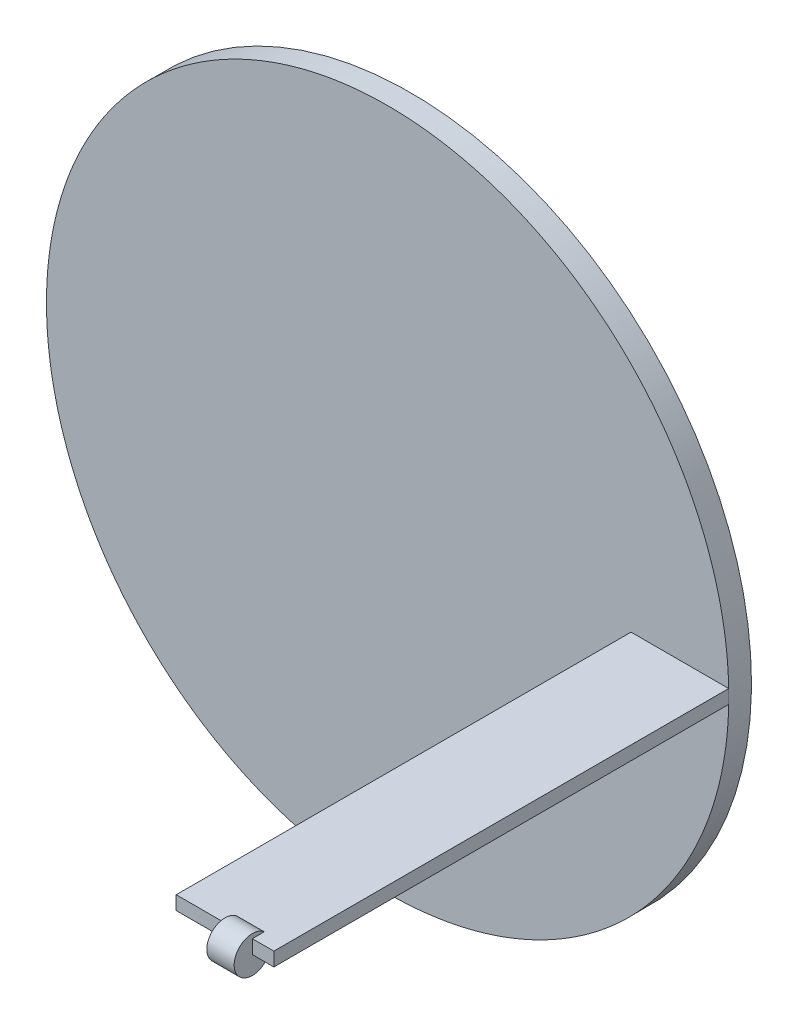
ISO-10303-21;
HEADER;
FILE_DESCRIPTION(('STEP AP214'),'2;1');
FILE_NAME('part.step','',(''),(''),'','','');
FILE_SCHEMA(('AUTOMOTIVE_DESIGN { 1 0 10303 214 1 1 1 1 }'));
ENDSEC;
DATA;
#1=APPLICATION_CONTEXT('core data for automotive mechanical design processes');
#2=APPLICATION_PROTOCOL_DEFINITION('international standard','automotive_design',2000,#1);
#3=PRODUCT_CONTEXT('',#1,'mechanical');
#4=PRODUCT('Part','Part','',(#3));
#5=PRODUCT_RELATED_PRODUCT_CATEGORY('part','',(#4));
#6=PRODUCT_DEFINITION_FORMATION('','',#4);
#7=PRODUCT_DEFINITION_CONTEXT('part definition',#1,'design');
#8=PRODUCT_DEFINITION('design','',#6,#7);
#9=PRODUCT_DEFINITION_SHAPE('','',#8);
#10=(LENGTH_UNIT() NAMED_UNIT(*) SI_UNIT(.MILLI.,.METRE.));
#11=(NAMED_UNIT(*) PLANE_ANGLE_UNIT() SI_UNIT($,.RADIAN.));
#12=(NAMED_UNIT(*) SI_UNIT($,.STERADIAN.) SOLID_ANGLE_UNIT());
#13=UNCERTAINTY_MEASURE_WITH_UNIT(LENGTH_MEASURE(1.E-05),#10,'distance_accuracy_value','');
#14=(GEOMETRIC_REPRESENTATION_CONTEXT(3) GLOBAL_UNCERTAINTY_ASSIGNED_CONTEXT((#13)) GLOBAL_UNIT_ASSIGNED_CONTEXT((#10,
#11,#12)) REPRESENTATION_CONTEXT('',''));
#15=CARTESIAN_POINT('',(0.,0.,0.));
#16=DIRECTION('',(0.,0.,1.));
#17=DIRECTION('',(1.,0.,0.));
#18=AXIS2_PLACEMENT_3D('',#15,#16,#17);
#19=CARTESIAN_POINT('',(70.2503955035648,-1.51817324004955,105.));
#20=DIRECTION('',(-1.,0.,0.));
#21=DIRECTION('',(0.,0.,1.));
#22=AXIS2_PLACEMENT_3D('',#19,#20,#21);
#23=CYLINDRICAL_SURFACE('',#22,3.99999999999997);
#24=CARTESIAN_POINT('',(70.2503955035648,-1.51817324004955,105.));
#25=DIRECTION('',(1.,0.,0.));
#26=DIRECTION('',(0.,0.,-1.));
#27=AXIS2_PLACEMENT_3D('',#24,#25,#26);
#28=CIRCLE('',#27,3.99999999999997);
#29=CARTESIAN_POINT('',(70.2503955035648,-1.51817324004955,101.));
#30=VERTEX_POINT('',#29);
#31=EDGE_CURVE('E11',#30,#30,#28,.T.);
#32=ORIENTED_EDGE('',*,*,#31,.F.);
#33=EDGE_LOOP('',(#32));
#34=FACE_BOUND('',#33,.T.);
#35=CARTESIAN_POINT('',(64.2503955035648,-1.51817324004955,105.));
#36=DIRECTION('',(1.,0.,0.));
#37=DIRECTION('',(0.,0.,-1.));
#38=AXIS2_PLACEMENT_3D('',#35,#36,#37);
#39=CIRCLE('',#38,3.99999999999997);
#40=CARTESIAN_POINT('',(64.2503955035648,-1.51817324004955,101.));
#41=VERTEX_POINT('',#40);
#42=EDGE_CURVE('E55',#41,#41,#39,.T.);
#43=ORIENTED_EDGE('',*,*,#42,.T.);
#44=EDGE_LOOP('',(#43));
#45=FACE_BOUND('',#44,.T.);
#46=ADVANCED_FACE('F52',(#34,#45),#23,.T.);
#47=CARTESIAN_POINT('',(70.2503955035648,-1.51817324004955,105.));
#48=DIRECTION('',(1.,0.,0.));
#49=DIRECTION('',(0.,0.,-1.));
#50=AXIS2_PLACEMENT_3D('',#47,#48,#49);
#51=PLANE('',#50);
#52=ORIENTED_EDGE('',*,*,#31,.T.);
#53=EDGE_LOOP('',(#52));
#54=FACE_BOUND('',#53,.T.);
#55=ADVANCED_FACE('F67',(#54),#51,.T.);
#56=CARTESIAN_POINT('',(64.2503955035648,-1.51817324004955,105.));
#57=DIRECTION('',(1.,0.,0.));
#58=DIRECTION('',(0.,0.,-1.));
#59=AXIS2_PLACEMENT_3D('',#56,#57,#58);
#60=PLANE('',#59);
#61=ORIENTED_EDGE('',*,*,#42,.F.);
#62=EDGE_LOOP('',(#61));
#63=FACE_BOUND('',#62,.T.);
#64=ADVANCED_FACE('F65',(#63),#60,.F.);
#65=CLOSED_SHELL('',(#46,#55,#64));
#66=MANIFOLD_SOLID_BREP('B2',#65);
#67=CARTESIAN_POINT('',(0.,0.,-31.));
#68=DIRECTION('',(0.,0.,1.));
#69=DIRECTION('',(1.,0.,0.));
#70=AXIS2_PLACEMENT_3D('',#67,#68,#69);
#71=CYLINDRICAL_SURFACE('',#70,4.);
#72=CARTESIAN_POINT('',(0.,0.,-31.));
#73=DIRECTION('',(0.,0.,1.));
#74=DIRECTION('',(1.,0.,0.));
#75=AXIS2_PLACEMENT_3D('',#72,#73,#74);
#76=CIRCLE('',#75,4.);
#77=CARTESIAN_POINT('',(4.,0.,-31.));
#78=VERTEX_POINT('',#77);
#79=EDGE_CURVE('E51',#78,#78,#76,.T.);
#80=ORIENTED_EDGE('',*,*,#79,.T.);
#81=EDGE_LOOP('',(#80));
#82=FACE_BOUND('',#81,.T.);
#83=CARTESIAN_POINT('',(0.,0.,-25.));
#84=DIRECTION('',(0.,0.,1.));
#85=DIRECTION('',(1.,0.,0.));
#86=AXIS2_PLACEMENT_3D('',#83,#84,#85);
#87=CIRCLE('',#86,4.);
#88=CARTESIAN_POINT('',(4.,0.,-25.));
#89=VERTEX_POINT('',#88);
#90=EDGE_CURVE('E104',#89,#89,#87,.T.);
#91=ORIENTED_EDGE('',*,*,#90,.F.);
#92=EDGE_LOOP('',(#91));
#93=FACE_BOUND('',#92,.T.);
#94=ADVANCED_FACE('F101',(#82,#93),#71,.T.);
#95=CARTESIAN_POINT('',(0.,0.,-31.));
#96=DIRECTION('',(0.,0.,1.));
#97=DIRECTION('',(1.,0.,0.));
#98=AXIS2_PLACEMENT_3D('',#95,#96,#97);
#99=PLANE('',#98);
#100=ORIENTED_EDGE('',*,*,#79,.F.);
#101=EDGE_LOOP('',(#100));
#102=FACE_BOUND('',#101,.T.);
#103=ADVANCED_FACE('F116',(#102),#99,.F.);
#104=CARTESIAN_POINT('',(0.,0.,-25.));
#105=DIRECTION('',(0.,0.,1.));
#106=DIRECTION('',(1.,0.,0.));
#107=AXIS2_PLACEMENT_3D('',#104,#105,#106);
#108=PLANE('',#107);
#109=ORIENTED_EDGE('',*,*,#90,.T.);
#110=EDGE_LOOP('',(#109));
#111=FACE_BOUND('',#110,.T.);
#112=ADVANCED_FACE('F113',(#111),#108,.T.);
#113=CLOSED_SHELL('',(#94,#103,#112));
#114=MANIFOLD_SOLID_BREP('B6',#113);
#115=CARTESIAN_POINT('',(0.,0.,5.));
#116=DIRECTION('',(0.,0.,-1.));
#117=DIRECTION('',(-1.,0.,0.));
#118=AXIS2_PLACEMENT_3D('',#115,#116,#117);
#119=CYLINDRICAL_SURFACE('',#118,75.);
#120=CARTESIAN_POINT('',(0.,0.,5.));
#121=DIRECTION('',(0.,0.,1.));
#122=DIRECTION('',(1.,0.,0.));
#123=AXIS2_PLACEMENT_3D('',#120,#121,#122);
#124=CIRCLE('',#123,75.);
#125=CARTESIAN_POINT('',(74.984632759074,-1.51817324004955,5.));
#126=VERTEX_POINT('',#125);
#127=EDGE_CURVE('E99',#126,#126,#124,.T.);
#128=ORIENTED_EDGE('',*,*,#127,.F.);
#129=EDGE_LOOP('',(#128));
#130=FACE_BOUND('',#129,.T.);
#131=CARTESIAN_POINT('',(0.,0.,0.));
#132=DIRECTION('',(0.,0.,1.));
#133=DIRECTION('',(1.,0.,0.));
#134=AXIS2_PLACEMENT_3D('',#131,#132,#133);
#135=CIRCLE('',#134,75.);
#136=CARTESIAN_POINT('',(75.,0.,0.));
#137=VERTEX_POINT('',#136);
#138=EDGE_CURVE('E150',#137,#137,#135,.T.);
#139=ORIENTED_EDGE('',*,*,#138,.T.);
#140=EDGE_LOOP('',(#139));
#141=FACE_BOUND('',#140,.T.);
#142=ADVANCED_FACE('F141',(#130,#141),#119,.T.);
#143=CARTESIAN_POINT('',(0.,0.,5.));
#144=DIRECTION('',(0.,0.,1.));
#145=DIRECTION('',(1.,0.,0.));
#146=AXIS2_PLACEMENT_3D('',#143,#144,#145);
#147=PLANE('',#146);
#148=DIRECTION('',(0.,1.,0.));
#149=VECTOR('',#148,1.);
#150=CARTESIAN_POINT('',(74.9846327590741,-1.51817324004955,5.));
#151=LINE('',#150,#149);
#152=CARTESIAN_POINT('',(74.9846327590741,1.50504399009494,5.));
#153=VERTEX_POINT('',#152);
#154=EDGE_CURVE('E206',#126,#153,#151,.T.);
#155=ORIENTED_EDGE('',*,*,#154,.F.);
#156=ORIENTED_EDGE('',*,*,#127,.T.);
#157=DIRECTION('',(1.,0.,0.));
#158=VECTOR('',#157,1.);
#159=CARTESIAN_POINT('',(74.9846327590741,-1.51817324004955,5.));
#160=LINE('',#159,#158);
#161=CARTESIAN_POINT('',(53.5161582480555,-1.51817324004956,5.));
#162=VERTEX_POINT('',#161);
#163=EDGE_CURVE('E157',#162,#126,#160,.T.);
#164=ORIENTED_EDGE('',*,*,#163,.F.);
#165=DIRECTION('',(0.,-1.,0.));
#166=VECTOR('',#165,1.);
#167=CARTESIAN_POINT('',(53.5161582480555,-1.51817324004956,5.));
#168=LINE('',#167,#166);
#169=CARTESIAN_POINT('',(53.5161582480555,1.50504399009494,5.));
#170=VERTEX_POINT('',#169);
#171=EDGE_CURVE('E253',#170,#162,#168,.T.);
#172=ORIENTED_EDGE('',*,*,#171,.F.);
#173=DIRECTION('',(-1.,0.,0.));
#174=VECTOR('',#173,1.);
#175=CARTESIAN_POINT('',(74.9846327590741,1.50504399009494,5.));
#176=LINE('',#175,#174);
#177=EDGE_CURVE('E163',#153,#170,#176,.T.);
#178=ORIENTED_EDGE('',*,*,#177,.F.);
#179=EDGE_LOOP('',(#155,#156,#164,#172,#178));
#180=FACE_BOUND('',#179,.T.);
#181=ADVANCED_FACE('F239',(#180),#147,.T.);
#182=CARTESIAN_POINT('',(0.,0.,0.));
#183=DIRECTION('',(0.,0.,1.));
#184=DIRECTION('',(1.,0.,0.));
#185=AXIS2_PLACEMENT_3D('',#182,#183,#184);
#186=PLANE('',#185);
#187=CARTESIAN_POINT('',(0.,0.,0.));
#188=DIRECTION('',(0.,0.,1.));
#189=DIRECTION('',(1.,0.,0.));
#190=AXIS2_PLACEMENT_3D('',#187,#188,#189);
#191=CIRCLE('',#190,10.);
#192=CARTESIAN_POINT('',(10.,0.,0.));
#193=VERTEX_POINT('',#192);
#194=EDGE_CURVE('E144',#193,#193,#191,.T.);
#195=ORIENTED_EDGE('',*,*,#194,.T.);
#196=EDGE_LOOP('',(#195));
#197=FACE_BOUND('',#196,.T.);
#198=ORIENTED_EDGE('',*,*,#138,.F.);
#199=EDGE_LOOP('',(#198));
#200=FACE_BOUND('',#199,.T.);
#201=ADVANCED_FACE('F225',(#197,#200),#186,.F.);
#202=CARTESIAN_POINT('',(0.,0.,-25.));
#203=DIRECTION('',(0.,0.,1.));
#204=DIRECTION('',(1.,0.,0.));
#205=AXIS2_PLACEMENT_3D('',#202,#203,#204);
#206=CYLINDRICAL_SURFACE('',#205,10.);
#207=CARTESIAN_POINT('',(0.,0.,-25.));
#208=DIRECTION('',(0.,0.,1.));
#209=DIRECTION('',(1.,0.,0.));
#210=AXIS2_PLACEMENT_3D('',#207,#208,#209);
#211=CIRCLE('',#210,10.);
#212=CARTESIAN_POINT('',(10.,0.,-25.));
#213=VERTEX_POINT('',#212);
#214=EDGE_CURVE('E208',#213,#213,#211,.T.);
#215=ORIENTED_EDGE('',*,*,#214,.T.);
#216=EDGE_LOOP('',(#215));
#217=FACE_BOUND('',#216,.T.);
#218=ORIENTED_EDGE('',*,*,#194,.F.);
#219=EDGE_LOOP('',(#218));
#220=FACE_BOUND('',#219,.T.);
#221=ADVANCED_FACE('F228',(#217,#220),#206,.T.);
#222=CARTESIAN_POINT('',(0.,0.,-25.));
#223=DIRECTION('',(0.,0.,1.));
#224=DIRECTION('',(1.,0.,0.));
#225=AXIS2_PLACEMENT_3D('',#222,#223,#224);
#226=PLANE('',#225);
#227=ORIENTED_EDGE('',*,*,#214,.F.);
#228=EDGE_LOOP('',(#227));
#229=FACE_BOUND('',#228,.T.);
#230=ADVANCED_FACE('F230',(#229),#226,.F.);
#231=CARTESIAN_POINT('',(74.9846327590741,-1.51817324004955,105.));
#232=DIRECTION('',(-1.,0.,0.));
#233=DIRECTION('',(0.,0.,1.));
#234=AXIS2_PLACEMENT_3D('',#231,#232,#233);
#235=PLANE('',#234);
#236=ORIENTED_EDGE('',*,*,#154,.T.);
#237=DIRECTION('',(0.,0.,-1.));
#238=VECTOR('',#237,1.);
#239=CARTESIAN_POINT('',(74.9846327590741,1.50504399009494,105.));
#240=LINE('',#239,#238);
#241=CARTESIAN_POINT('',(74.9846327590741,1.50504399009494,105.));
#242=VERTEX_POINT('',#241);
#243=EDGE_CURVE('E186',#242,#153,#240,.T.);
#244=ORIENTED_EDGE('',*,*,#243,.F.);
#245=DIRECTION('',(0.,1.,0.));
#246=VECTOR('',#245,1.);
#247=CARTESIAN_POINT('',(74.9846327590741,-1.51817324004955,105.));
#248=LINE('',#247,#246);
#249=CARTESIAN_POINT('',(74.9846327590741,-1.51817324004955,105.));
#250=VERTEX_POINT('',#249);
#251=EDGE_CURVE('E194',#250,#242,#248,.T.);
#252=ORIENTED_EDGE('',*,*,#251,.F.);
#253=DIRECTION('',(0.,0.,-1.));
#254=VECTOR('',#253,1.);
#255=CARTESIAN_POINT('',(74.9846327590741,-1.51817324004955,105.));
#256=LINE('',#255,#254);
#257=EDGE_CURVE('E250',#250,#126,#256,.T.);
#258=ORIENTED_EDGE('',*,*,#257,.T.);
#259=EDGE_LOOP('',(#236,#244,#252,#258));
#260=FACE_BOUND('',#259,.T.);
#261=ADVANCED_FACE('F205',(#260),#235,.F.);
#262=CARTESIAN_POINT('',(74.9846327590741,1.50504399009494,105.));
#263=DIRECTION('',(0.,-1.,0.));
#264=DIRECTION('',(0.,0.,-1.));
#265=AXIS2_PLACEMENT_3D('',#262,#263,#264);
#266=PLANE('',#265);
#267=ORIENTED_EDGE('',*,*,#177,.T.);
#268=DIRECTION('',(0.,0.,-1.));
#269=VECTOR('',#268,1.);
#270=CARTESIAN_POINT('',(53.5161582480555,1.50504399009494,105.));
#271=LINE('',#270,#269);
#272=CARTESIAN_POINT('',(53.5161582480555,1.50504399009494,105.));
#273=VERTEX_POINT('',#272);
#274=EDGE_CURVE('E189',#273,#170,#271,.T.);
#275=ORIENTED_EDGE('',*,*,#274,.F.);
#276=DIRECTION('',(-1.,0.,0.));
#277=VECTOR('',#276,1.);
#278=CARTESIAN_POINT('',(74.9846327590741,1.50504399009494,105.));
#279=LINE('',#278,#277);
#280=EDGE_CURVE('E182',#242,#273,#279,.T.);
#281=ORIENTED_EDGE('',*,*,#280,.F.);
#282=ORIENTED_EDGE('',*,*,#243,.T.);
#283=EDGE_LOOP('',(#267,#275,#281,#282));
#284=FACE_BOUND('',#283,.T.);
#285=ADVANCED_FACE('F184',(#284),#266,.F.);
#286=CARTESIAN_POINT('',(53.5161582480555,-1.51817324004956,105.));
#287=DIRECTION('',(1.,0.,0.));
#288=DIRECTION('',(0.,0.,-1.));
#289=AXIS2_PLACEMENT_3D('',#286,#287,#288);
#290=PLANE('',#289);
#291=ORIENTED_EDGE('',*,*,#171,.T.);
#292=DIRECTION('',(0.,0.,-1.));
#293=VECTOR('',#292,1.);
#294=CARTESIAN_POINT('',(53.5161582480555,-1.51817324004956,105.));
#295=LINE('',#294,#293);
#296=CARTESIAN_POINT('',(53.5161582480555,-1.51817324004956,105.));
#297=VERTEX_POINT('',#296);
#298=EDGE_CURVE('E214',#297,#162,#295,.T.);
#299=ORIENTED_EDGE('',*,*,#298,.F.);
#300=DIRECTION('',(0.,-1.,0.));
#301=VECTOR('',#300,1.);
#302=CARTESIAN_POINT('',(53.5161582480555,-1.51817324004956,105.));
#303=LINE('',#302,#301);
#304=EDGE_CURVE('E193',#273,#297,#303,.T.);
#305=ORIENTED_EDGE('',*,*,#304,.F.);
#306=ORIENTED_EDGE('',*,*,#274,.T.);
#307=EDGE_LOOP('',(#291,#299,#305,#306));
#308=FACE_BOUND('',#307,.T.);
#309=ADVANCED_FACE('F269',(#308),#290,.F.);
#310=CARTESIAN_POINT('',(74.9846327590741,-1.51817324004955,105.));
#311=DIRECTION('',(0.,1.,0.));
#312=DIRECTION('',(-1.,0.,0.));
#313=AXIS2_PLACEMENT_3D('',#310,#311,#312);
#314=PLANE('',#313);
#315=ORIENTED_EDGE('',*,*,#163,.T.);
#316=ORIENTED_EDGE('',*,*,#257,.F.);
#317=DIRECTION('',(1.,0.,0.));
#318=VECTOR('',#317,1.);
#319=CARTESIAN_POINT('',(74.9846327590741,-1.51817324004955,105.));
#320=LINE('',#319,#318);
#321=EDGE_CURVE('E199',#297,#250,#320,.T.);
#322=ORIENTED_EDGE('',*,*,#321,.F.);
#323=ORIENTED_EDGE('',*,*,#298,.T.);
#324=EDGE_LOOP('',(#315,#316,#322,#323));
#325=FACE_BOUND('',#324,.T.);
#326=ADVANCED_FACE('F249',(#325),#314,.F.);
#327=CARTESIAN_POINT('',(0.,0.,105.));
#328=DIRECTION('',(0.,0.,1.));
#329=DIRECTION('',(1.,0.,0.));
#330=AXIS2_PLACEMENT_3D('',#327,#328,#329);
#331=PLANE('',#330);
#332=ORIENTED_EDGE('',*,*,#251,.T.);
#333=ORIENTED_EDGE('',*,*,#280,.T.);
#334=ORIENTED_EDGE('',*,*,#304,.T.);
#335=ORIENTED_EDGE('',*,*,#321,.T.);
#336=EDGE_LOOP('',(#332,#333,#334,#335));
#337=FACE_BOUND('',#336,.T.);
#338=ADVANCED_FACE('F197',(#337),#331,.T.);
#339=CLOSED_SHELL('',(#142,#181,#201,#221,#230,#261,#285,#309,#326,#338));
#340=MANIFOLD_SOLID_BREP('B46',#339);
#341=ADVANCED_BREP_SHAPE_REPRESENTATION('',(#18,#66,#114,#340),#14);
#342=SHAPE_DEFINITION_REPRESENTATION(#9,#341);
ENDSEC;
END-ISO-10303-21;
